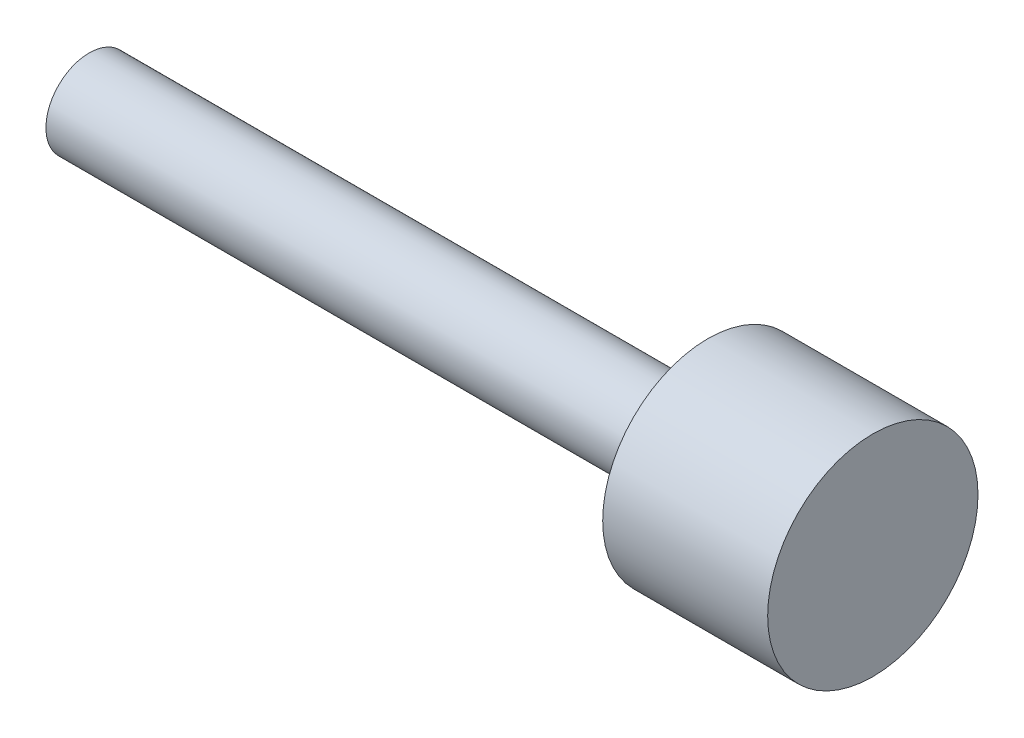
ISO-10303-21;
HEADER;
FILE_DESCRIPTION(('STEP AP214'),'2;1');
FILE_NAME('part.step','',(''),(''),'','','');
FILE_SCHEMA(('AUTOMOTIVE_DESIGN { 1 0 10303 214 1 1 1 1 }'));
ENDSEC;
DATA;
#1=APPLICATION_CONTEXT('core data for automotive mechanical design processes');
#2=APPLICATION_PROTOCOL_DEFINITION('international standard','automotive_design',2000,#1);
#3=PRODUCT_CONTEXT('',#1,'mechanical');
#4=PRODUCT('Part','Part','',(#3));
#5=PRODUCT_RELATED_PRODUCT_CATEGORY('part','',(#4));
#6=PRODUCT_DEFINITION_FORMATION('','',#4);
#7=PRODUCT_DEFINITION_CONTEXT('part definition',#1,'design');
#8=PRODUCT_DEFINITION('design','',#6,#7);
#9=PRODUCT_DEFINITION_SHAPE('','',#8);
#10=(LENGTH_UNIT() NAMED_UNIT(*) SI_UNIT(.MILLI.,.METRE.));
#11=(NAMED_UNIT(*) PLANE_ANGLE_UNIT() SI_UNIT($,.RADIAN.));
#12=(NAMED_UNIT(*) SI_UNIT($,.STERADIAN.) SOLID_ANGLE_UNIT());
#13=UNCERTAINTY_MEASURE_WITH_UNIT(LENGTH_MEASURE(1.E-05),#10,'distance_accuracy_value','');
#14=(GEOMETRIC_REPRESENTATION_CONTEXT(3) GLOBAL_UNCERTAINTY_ASSIGNED_CONTEXT((#13)) GLOBAL_UNIT_ASSIGNED_CONTEXT((#10,
#11,#12)) REPRESENTATION_CONTEXT('',''));
#15=CARTESIAN_POINT('',(0.,0.,0.));
#16=DIRECTION('',(0.,0.,1.));
#17=DIRECTION('',(1.,0.,0.));
#18=AXIS2_PLACEMENT_3D('',#15,#16,#17);
#19=CARTESIAN_POINT('',(0.,0.,0.));
#20=DIRECTION('',(-1.,0.,0.));
#21=DIRECTION('',(0.,0.,1.));
#22=AXIS2_PLACEMENT_3D('',#19,#20,#21);
#23=PLANE('',#22);
#24=CARTESIAN_POINT('',(0.,0.,0.));
#25=DIRECTION('',(1.,0.,0.));
#26=DIRECTION('',(0.,0.,-1.));
#27=AXIS2_PLACEMENT_3D('',#24,#25,#26);
#28=CIRCLE('',#27,2.1);
#29=CARTESIAN_POINT('',(0.,0.,-2.1));
#30=VERTEX_POINT('',#29);
#31=EDGE_CURVE('E10',#30,#30,#28,.T.);
#32=ORIENTED_EDGE('',*,*,#31,.F.);
#33=EDGE_LOOP('',(#32));
#34=FACE_BOUND('',#33,.T.);
#35=ADVANCED_FACE('F32',(#34),#23,.T.);
#36=CARTESIAN_POINT('',(33.,0.,0.));
#37=DIRECTION('',(1.,0.,0.));
#38=DIRECTION('',(0.,0.,-1.));
#39=AXIS2_PLACEMENT_3D('',#36,#37,#38);
#40=CYLINDRICAL_SURFACE('',#39,2.1);
#41=ORIENTED_EDGE('',*,*,#31,.T.);
#42=EDGE_LOOP('',(#41));
#43=FACE_BOUND('',#42,.T.);
#44=CARTESIAN_POINT('',(30.,0.,0.));
#45=DIRECTION('',(1.,0.,0.));
#46=DIRECTION('',(0.,0.,-1.));
#47=AXIS2_PLACEMENT_3D('',#44,#45,#46);
#48=CIRCLE('',#47,2.1);
#49=CARTESIAN_POINT('',(30.,0.,-2.1));
#50=VERTEX_POINT('',#49);
#51=EDGE_CURVE('E38',#50,#50,#48,.T.);
#52=ORIENTED_EDGE('',*,*,#51,.F.);
#53=EDGE_LOOP('',(#52));
#54=FACE_BOUND('',#53,.T.);
#55=ADVANCED_FACE('F64',(#43,#54),#40,.T.);
#56=CARTESIAN_POINT('',(30.,2.1,0.));
#57=DIRECTION('',(-1.,0.,0.));
#58=DIRECTION('',(0.,0.,1.));
#59=AXIS2_PLACEMENT_3D('',#56,#57,#58);
#60=PLANE('',#59);
#61=ORIENTED_EDGE('',*,*,#51,.T.);
#62=EDGE_LOOP('',(#61));
#63=FACE_BOUND('',#62,.T.);
#64=CARTESIAN_POINT('',(30.,0.,0.));
#65=DIRECTION('',(1.,0.,0.));
#66=DIRECTION('',(0.,0.,-1.));
#67=AXIS2_PLACEMENT_3D('',#64,#65,#66);
#68=CIRCLE('',#67,5.1);
#69=CARTESIAN_POINT('',(30.,0.,-5.1));
#70=VERTEX_POINT('',#69);
#71=EDGE_CURVE('E42',#70,#70,#68,.T.);
#72=ORIENTED_EDGE('',*,*,#71,.F.);
#73=EDGE_LOOP('',(#72));
#74=FACE_BOUND('',#73,.T.);
#75=ADVANCED_FACE('F56',(#63,#74),#60,.T.);
#76=CARTESIAN_POINT('',(33.,0.,0.));
#77=DIRECTION('',(1.,0.,0.));
#78=DIRECTION('',(0.,0.,-1.));
#79=AXIS2_PLACEMENT_3D('',#76,#77,#78);
#80=CYLINDRICAL_SURFACE('',#79,5.1);
#81=ORIENTED_EDGE('',*,*,#71,.T.);
#82=EDGE_LOOP('',(#81));
#83=FACE_BOUND('',#82,.T.);
#84=CARTESIAN_POINT('',(38.,0.,0.));
#85=DIRECTION('',(1.,0.,0.));
#86=DIRECTION('',(0.,0.,-1.));
#87=AXIS2_PLACEMENT_3D('',#84,#85,#86);
#88=CIRCLE('',#87,5.1);
#89=CARTESIAN_POINT('',(38.,0.,-5.1));
#90=VERTEX_POINT('',#89);
#91=EDGE_CURVE('E46',#90,#90,#88,.T.);
#92=ORIENTED_EDGE('',*,*,#91,.F.);
#93=EDGE_LOOP('',(#92));
#94=FACE_BOUND('',#93,.T.);
#95=ADVANCED_FACE('F54',(#83,#94),#80,.T.);
#96=CARTESIAN_POINT('',(38.,0.,0.));
#97=DIRECTION('',(1.,0.,0.));
#98=DIRECTION('',(0.,0.,-1.));
#99=AXIS2_PLACEMENT_3D('',#96,#97,#98);
#100=PLANE('',#99);
#101=ORIENTED_EDGE('',*,*,#91,.T.);
#102=EDGE_LOOP('',(#101));
#103=FACE_BOUND('',#102,.T.);
#104=ADVANCED_FACE('F52',(#103),#100,.T.);
#105=CLOSED_SHELL('',(#35,#55,#75,#95,#104));
#106=MANIFOLD_SOLID_BREP('B2',#105);
#107=ADVANCED_BREP_SHAPE_REPRESENTATION('',(#18,#106),#14);
#108=SHAPE_DEFINITION_REPRESENTATION(#9,#107);
ENDSEC;
END-ISO-10303-21;
